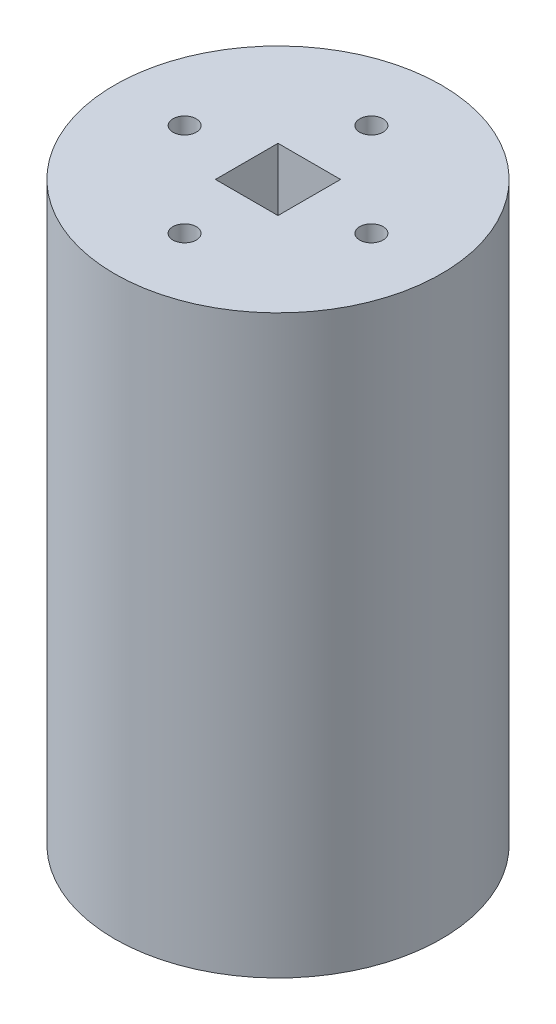
ISO-10303-21;
HEADER;
FILE_DESCRIPTION(('STEP AP214'),'2;1');
FILE_NAME('part.step','',(''),(''),'','','');
FILE_SCHEMA(('AUTOMOTIVE_DESIGN { 1 0 10303 214 1 1 1 1 }'));
ENDSEC;
DATA;
#1=APPLICATION_CONTEXT('core data for automotive mechanical design processes');
#2=APPLICATION_PROTOCOL_DEFINITION('international standard','automotive_design',2000,#1);
#3=PRODUCT_CONTEXT('',#1,'mechanical');
#4=PRODUCT('Part','Part','',(#3));
#5=PRODUCT_RELATED_PRODUCT_CATEGORY('part','',(#4));
#6=PRODUCT_DEFINITION_FORMATION('','',#4);
#7=PRODUCT_DEFINITION_CONTEXT('part definition',#1,'design');
#8=PRODUCT_DEFINITION('design','',#6,#7);
#9=PRODUCT_DEFINITION_SHAPE('','',#8);
#10=(LENGTH_UNIT() NAMED_UNIT(*) SI_UNIT(.MILLI.,.METRE.));
#11=(NAMED_UNIT(*) PLANE_ANGLE_UNIT() SI_UNIT($,.RADIAN.));
#12=(NAMED_UNIT(*) SI_UNIT($,.STERADIAN.) SOLID_ANGLE_UNIT());
#13=UNCERTAINTY_MEASURE_WITH_UNIT(LENGTH_MEASURE(1.E-05),#10,'distance_accuracy_value','');
#14=(GEOMETRIC_REPRESENTATION_CONTEXT(3) GLOBAL_UNCERTAINTY_ASSIGNED_CONTEXT((#13)) GLOBAL_UNIT_ASSIGNED_CONTEXT((#10,
#11,#12)) REPRESENTATION_CONTEXT('',''));
#15=CARTESIAN_POINT('',(0.,0.,0.));
#16=DIRECTION('',(0.,0.,1.));
#17=DIRECTION('',(1.,0.,0.));
#18=AXIS2_PLACEMENT_3D('',#15,#16,#17);
#19=CARTESIAN_POINT('',(0.,-61.675,-3.35));
#20=DIRECTION('',(0.,0.,1.));
#21=DIRECTION('',(1.,0.,0.));
#22=AXIS2_PLACEMENT_3D('',#19,#20,#21);
#23=PLANE('',#22);
#24=DIRECTION('',(1.,0.,0.));
#25=VECTOR('',#24,1.);
#26=CARTESIAN_POINT('',(0.,0.,-3.35));
#27=LINE('',#26,#25);
#28=CARTESIAN_POINT('',(-3.35,0.,-3.35));
#29=VERTEX_POINT('',#28);
#30=CARTESIAN_POINT('',(3.35,0.,-3.35));
#31=VERTEX_POINT('',#30);
#32=EDGE_CURVE('E119',#29,#31,#27,.T.);
#33=ORIENTED_EDGE('',*,*,#32,.F.);
#34=DIRECTION('',(0.,1.,0.));
#35=VECTOR('',#34,1.);
#36=CARTESIAN_POINT('',(-3.35,-61.675,-3.35));
#37=LINE('',#36,#35);
#38=CARTESIAN_POINT('',(-3.35,-61.675,-3.35));
#39=VERTEX_POINT('',#38);
#40=EDGE_CURVE('E11',#39,#29,#37,.T.);
#41=ORIENTED_EDGE('',*,*,#40,.F.);
#42=DIRECTION('',(1.,0.,0.));
#43=VECTOR('',#42,1.);
#44=CARTESIAN_POINT('',(0.,-61.675,-3.35));
#45=LINE('',#44,#43);
#46=CARTESIAN_POINT('',(3.35,-61.675,-3.35));
#47=VERTEX_POINT('',#46);
#48=EDGE_CURVE('E106',#39,#47,#45,.T.);
#49=ORIENTED_EDGE('',*,*,#48,.T.);
#50=DIRECTION('',(0.,1.,0.));
#51=VECTOR('',#50,1.);
#52=CARTESIAN_POINT('',(3.35,-61.675,-3.35));
#53=LINE('',#52,#51);
#54=EDGE_CURVE('E45',#47,#31,#53,.T.);
#55=ORIENTED_EDGE('',*,*,#54,.T.);
#56=EDGE_LOOP('',(#33,#41,#49,#55));
#57=FACE_BOUND('',#56,.T.);
#58=ADVANCED_FACE('F41',(#57),#23,.T.);
#59=CARTESIAN_POINT('',(-3.35,-61.675,0.));
#60=DIRECTION('',(-1.,0.,0.));
#61=DIRECTION('',(0.,0.,1.));
#62=AXIS2_PLACEMENT_3D('',#59,#60,#61);
#63=PLANE('',#62);
#64=DIRECTION('',(0.,0.,1.));
#65=VECTOR('',#64,1.);
#66=CARTESIAN_POINT('',(-3.35,0.,0.));
#67=LINE('',#66,#65);
#68=CARTESIAN_POINT('',(-3.35,0.,3.35));
#69=VERTEX_POINT('',#68);
#70=EDGE_CURVE('E129',#29,#69,#67,.T.);
#71=ORIENTED_EDGE('',*,*,#70,.T.);
#72=DIRECTION('',(0.,1.,0.));
#73=VECTOR('',#72,1.);
#74=CARTESIAN_POINT('',(-3.35,-61.675,3.35));
#75=LINE('',#74,#73);
#76=CARTESIAN_POINT('',(-3.35,-61.675,3.35));
#77=VERTEX_POINT('',#76);
#78=EDGE_CURVE('E52',#77,#69,#75,.T.);
#79=ORIENTED_EDGE('',*,*,#78,.F.);
#80=DIRECTION('',(0.,0.,1.));
#81=VECTOR('',#80,1.);
#82=CARTESIAN_POINT('',(-3.35,-61.675,0.));
#83=LINE('',#82,#81);
#84=EDGE_CURVE('E96',#39,#77,#83,.T.);
#85=ORIENTED_EDGE('',*,*,#84,.F.);
#86=ORIENTED_EDGE('',*,*,#40,.T.);
#87=EDGE_LOOP('',(#71,#79,#85,#86));
#88=FACE_BOUND('',#87,.T.);
#89=ADVANCED_FACE('F133',(#88),#63,.F.);
#90=CARTESIAN_POINT('',(0.,-61.675,3.35));
#91=DIRECTION('',(0.,0.,1.));
#92=DIRECTION('',(1.,0.,0.));
#93=AXIS2_PLACEMENT_3D('',#90,#91,#92);
#94=PLANE('',#93);
#95=DIRECTION('',(1.,0.,0.));
#96=VECTOR('',#95,1.);
#97=CARTESIAN_POINT('',(0.,0.,3.35));
#98=LINE('',#97,#96);
#99=CARTESIAN_POINT('',(3.35,0.,3.35));
#100=VERTEX_POINT('',#99);
#101=EDGE_CURVE('E77',#69,#100,#98,.T.);
#102=ORIENTED_EDGE('',*,*,#101,.T.);
#103=DIRECTION('',(0.,1.,0.));
#104=VECTOR('',#103,1.);
#105=CARTESIAN_POINT('',(3.35,-61.675,3.35));
#106=LINE('',#105,#104);
#107=CARTESIAN_POINT('',(3.35,-61.675,3.35));
#108=VERTEX_POINT('',#107);
#109=EDGE_CURVE('E101',#108,#100,#106,.T.);
#110=ORIENTED_EDGE('',*,*,#109,.F.);
#111=DIRECTION('',(1.,0.,0.));
#112=VECTOR('',#111,1.);
#113=CARTESIAN_POINT('',(0.,-61.675,3.35));
#114=LINE('',#113,#112);
#115=EDGE_CURVE('E91',#77,#108,#114,.T.);
#116=ORIENTED_EDGE('',*,*,#115,.F.);
#117=ORIENTED_EDGE('',*,*,#78,.T.);
#118=EDGE_LOOP('',(#102,#110,#116,#117));
#119=FACE_BOUND('',#118,.T.);
#120=ADVANCED_FACE('F102',(#119),#94,.F.);
#121=CARTESIAN_POINT('',(0.,-61.675,0.));
#122=DIRECTION('',(0.,1.,0.));
#123=DIRECTION('',(0.,0.,1.));
#124=AXIS2_PLACEMENT_3D('',#121,#122,#123);
#125=CYLINDRICAL_SURFACE('',#124,17.5);
#126=CARTESIAN_POINT('',(0.,-61.675,0.));
#127=DIRECTION('',(0.,1.,0.));
#128=DIRECTION('',(0.,0.,1.));
#129=AXIS2_PLACEMENT_3D('',#126,#127,#128);
#130=CIRCLE('',#129,17.5);
#131=CARTESIAN_POINT('',(0.,-61.675,17.5));
#132=VERTEX_POINT('',#131);
#133=EDGE_CURVE('E109',#132,#132,#130,.T.);
#134=ORIENTED_EDGE('',*,*,#133,.T.);
#135=EDGE_LOOP('',(#134));
#136=FACE_BOUND('',#135,.T.);
#137=CARTESIAN_POINT('',(0.,0.,0.));
#138=DIRECTION('',(0.,1.,0.));
#139=DIRECTION('',(0.,0.,1.));
#140=AXIS2_PLACEMENT_3D('',#137,#138,#139);
#141=CIRCLE('',#140,17.5);
#142=CARTESIAN_POINT('',(0.,0.,17.5));
#143=VERTEX_POINT('',#142);
#144=EDGE_CURVE('E115',#143,#143,#141,.T.);
#145=ORIENTED_EDGE('',*,*,#144,.F.);
#146=EDGE_LOOP('',(#145));
#147=FACE_BOUND('',#146,.T.);
#148=ADVANCED_FACE('F43',(#136,#147),#125,.T.);
#149=CARTESIAN_POINT('',(3.35,-61.675,0.));
#150=DIRECTION('',(-1.,0.,0.));
#151=DIRECTION('',(0.,0.,1.));
#152=AXIS2_PLACEMENT_3D('',#149,#150,#151);
#153=PLANE('',#152);
#154=DIRECTION('',(0.,0.,1.));
#155=VECTOR('',#154,1.);
#156=CARTESIAN_POINT('',(3.35,0.,0.));
#157=LINE('',#156,#155);
#158=EDGE_CURVE('E124',#31,#100,#157,.T.);
#159=ORIENTED_EDGE('',*,*,#158,.F.);
#160=ORIENTED_EDGE('',*,*,#54,.F.);
#161=DIRECTION('',(0.,0.,1.));
#162=VECTOR('',#161,1.);
#163=CARTESIAN_POINT('',(3.35,-61.675,0.));
#164=LINE('',#163,#162);
#165=EDGE_CURVE('E95',#47,#108,#164,.T.);
#166=ORIENTED_EDGE('',*,*,#165,.T.);
#167=ORIENTED_EDGE('',*,*,#109,.T.);
#168=EDGE_LOOP('',(#159,#160,#166,#167));
#169=FACE_BOUND('',#168,.T.);
#170=ADVANCED_FACE('F104',(#169),#153,.T.);
#171=CARTESIAN_POINT('',(0.,-61.675,0.));
#172=DIRECTION('',(0.,1.,0.));
#173=DIRECTION('',(0.,0.,1.));
#174=AXIS2_PLACEMENT_3D('',#171,#172,#173);
#175=PLANE('',#174);
#176=CARTESIAN_POINT('',(0.,-61.675,-10.));
#177=DIRECTION('',(0.,1.,0.));
#178=DIRECTION('',(0.,0.,1.));
#179=AXIS2_PLACEMENT_3D('',#176,#177,#178);
#180=CIRCLE('',#179,1.24999999999999);
#181=CARTESIAN_POINT('',(0.,-61.675,-8.75000000000001));
#182=VERTEX_POINT('',#181);
#183=EDGE_CURVE('E172',#182,#182,#180,.T.);
#184=ORIENTED_EDGE('',*,*,#183,.T.);
#185=EDGE_LOOP('',(#184));
#186=FACE_BOUND('',#185,.T.);
#187=CARTESIAN_POINT('',(10.,-61.675,0.));
#188=DIRECTION('',(0.,1.,0.));
#189=DIRECTION('',(0.,0.,1.));
#190=AXIS2_PLACEMENT_3D('',#187,#188,#189);
#191=CIRCLE('',#190,1.24999999999999);
#192=CARTESIAN_POINT('',(10.,-61.675,1.24999999999999));
#193=VERTEX_POINT('',#192);
#194=EDGE_CURVE('E185',#193,#193,#191,.T.);
#195=ORIENTED_EDGE('',*,*,#194,.T.);
#196=EDGE_LOOP('',(#195));
#197=FACE_BOUND('',#196,.T.);
#198=CARTESIAN_POINT('',(-10.,-61.675,0.));
#199=DIRECTION('',(0.,1.,0.));
#200=DIRECTION('',(0.,0.,1.));
#201=AXIS2_PLACEMENT_3D('',#198,#199,#200);
#202=CIRCLE('',#201,1.24999999999999);
#203=CARTESIAN_POINT('',(-10.,-61.675,1.24999999999999));
#204=VERTEX_POINT('',#203);
#205=EDGE_CURVE('E193',#204,#204,#202,.T.);
#206=ORIENTED_EDGE('',*,*,#205,.T.);
#207=EDGE_LOOP('',(#206));
#208=FACE_BOUND('',#207,.T.);
#209=CARTESIAN_POINT('',(0.,-61.675,10.));
#210=DIRECTION('',(0.,1.,0.));
#211=DIRECTION('',(0.,0.,1.));
#212=AXIS2_PLACEMENT_3D('',#209,#210,#211);
#213=CIRCLE('',#212,1.24999999999999);
#214=CARTESIAN_POINT('',(0.,-61.675,11.25));
#215=VERTEX_POINT('',#214);
#216=EDGE_CURVE('E120',#215,#215,#213,.T.);
#217=ORIENTED_EDGE('',*,*,#216,.T.);
#218=EDGE_LOOP('',(#217));
#219=FACE_BOUND('',#218,.T.);
#220=ORIENTED_EDGE('',*,*,#133,.F.);
#221=EDGE_LOOP('',(#220));
#222=FACE_BOUND('',#221,.T.);
#223=ORIENTED_EDGE('',*,*,#48,.F.);
#224=ORIENTED_EDGE('',*,*,#84,.T.);
#225=ORIENTED_EDGE('',*,*,#115,.T.);
#226=ORIENTED_EDGE('',*,*,#165,.F.);
#227=EDGE_LOOP('',(#223,#224,#225,#226));
#228=FACE_BOUND('',#227,.T.);
#229=ADVANCED_FACE('F94',(#186,#197,#208,#219,#222,#228),#175,.F.);
#230=CARTESIAN_POINT('',(0.,0.,0.));
#231=DIRECTION('',(0.,1.,0.));
#232=DIRECTION('',(0.,0.,1.));
#233=AXIS2_PLACEMENT_3D('',#230,#231,#232);
#234=PLANE('',#233);
#235=CARTESIAN_POINT('',(0.,0.,-10.));
#236=DIRECTION('',(0.,1.,0.));
#237=DIRECTION('',(0.,0.,1.));
#238=AXIS2_PLACEMENT_3D('',#235,#236,#237);
#239=CIRCLE('',#238,1.25);
#240=CARTESIAN_POINT('',(0.,0.,-8.75));
#241=VERTEX_POINT('',#240);
#242=EDGE_CURVE('E175',#241,#241,#239,.T.);
#243=ORIENTED_EDGE('',*,*,#242,.F.);
#244=EDGE_LOOP('',(#243));
#245=FACE_BOUND('',#244,.T.);
#246=CARTESIAN_POINT('',(10.,0.,0.));
#247=DIRECTION('',(0.,1.,0.));
#248=DIRECTION('',(0.,0.,1.));
#249=AXIS2_PLACEMENT_3D('',#246,#247,#248);
#250=CIRCLE('',#249,1.25);
#251=CARTESIAN_POINT('',(10.,0.,1.25));
#252=VERTEX_POINT('',#251);
#253=EDGE_CURVE('E179',#252,#252,#250,.T.);
#254=ORIENTED_EDGE('',*,*,#253,.F.);
#255=EDGE_LOOP('',(#254));
#256=FACE_BOUND('',#255,.T.);
#257=CARTESIAN_POINT('',(-10.,0.,0.));
#258=DIRECTION('',(0.,1.,0.));
#259=DIRECTION('',(0.,0.,1.));
#260=AXIS2_PLACEMENT_3D('',#257,#258,#259);
#261=CIRCLE('',#260,1.25);
#262=CARTESIAN_POINT('',(-10.,0.,1.25));
#263=VERTEX_POINT('',#262);
#264=EDGE_CURVE('E189',#263,#263,#261,.T.);
#265=ORIENTED_EDGE('',*,*,#264,.F.);
#266=EDGE_LOOP('',(#265));
#267=FACE_BOUND('',#266,.T.);
#268=CARTESIAN_POINT('',(0.,0.,10.));
#269=DIRECTION('',(0.,1.,0.));
#270=DIRECTION('',(0.,0.,1.));
#271=AXIS2_PLACEMENT_3D('',#268,#269,#270);
#272=CIRCLE('',#271,1.25);
#273=CARTESIAN_POINT('',(0.,0.,11.25));
#274=VERTEX_POINT('',#273);
#275=EDGE_CURVE('E197',#274,#274,#272,.T.);
#276=ORIENTED_EDGE('',*,*,#275,.F.);
#277=EDGE_LOOP('',(#276));
#278=FACE_BOUND('',#277,.T.);
#279=ORIENTED_EDGE('',*,*,#144,.T.);
#280=EDGE_LOOP('',(#279));
#281=FACE_BOUND('',#280,.T.);
#282=ORIENTED_EDGE('',*,*,#32,.T.);
#283=ORIENTED_EDGE('',*,*,#158,.T.);
#284=ORIENTED_EDGE('',*,*,#101,.F.);
#285=ORIENTED_EDGE('',*,*,#70,.F.);
#286=EDGE_LOOP('',(#282,#283,#284,#285));
#287=FACE_BOUND('',#286,.T.);
#288=ADVANCED_FACE('F134',(#245,#256,#267,#278,#281,#287),#234,.T.);
#289=CARTESIAN_POINT('',(0.,0.,10.));
#290=DIRECTION('',(0.,1.,0.));
#291=DIRECTION('',(0.,0.,1.));
#292=AXIS2_PLACEMENT_3D('',#289,#290,#291);
#293=CYLINDRICAL_SURFACE('',#292,1.24999999999999);
#294=ORIENTED_EDGE('',*,*,#216,.F.);
#295=EDGE_LOOP('',(#294));
#296=FACE_BOUND('',#295,.T.);
#297=ORIENTED_EDGE('',*,*,#275,.T.);
#298=EDGE_LOOP('',(#297));
#299=FACE_BOUND('',#298,.T.);
#300=ADVANCED_FACE('F148',(#296,#299),#293,.F.);
#301=CARTESIAN_POINT('',(-10.,0.,0.));
#302=DIRECTION('',(0.,1.,0.));
#303=DIRECTION('',(0.,0.,1.));
#304=AXIS2_PLACEMENT_3D('',#301,#302,#303);
#305=CYLINDRICAL_SURFACE('',#304,1.24999999999999);
#306=ORIENTED_EDGE('',*,*,#205,.F.);
#307=EDGE_LOOP('',(#306));
#308=FACE_BOUND('',#307,.T.);
#309=ORIENTED_EDGE('',*,*,#264,.T.);
#310=EDGE_LOOP('',(#309));
#311=FACE_BOUND('',#310,.T.);
#312=ADVANCED_FACE('F155',(#308,#311),#305,.F.);
#313=CARTESIAN_POINT('',(10.,0.,0.));
#314=DIRECTION('',(0.,1.,0.));
#315=DIRECTION('',(0.,0.,1.));
#316=AXIS2_PLACEMENT_3D('',#313,#314,#315);
#317=CYLINDRICAL_SURFACE('',#316,1.24999999999999);
#318=ORIENTED_EDGE('',*,*,#194,.F.);
#319=EDGE_LOOP('',(#318));
#320=FACE_BOUND('',#319,.T.);
#321=ORIENTED_EDGE('',*,*,#253,.T.);
#322=EDGE_LOOP('',(#321));
#323=FACE_BOUND('',#322,.T.);
#324=ADVANCED_FACE('F159',(#320,#323),#317,.F.);
#325=CARTESIAN_POINT('',(0.,0.,-10.));
#326=DIRECTION('',(0.,1.,0.));
#327=DIRECTION('',(0.,0.,1.));
#328=AXIS2_PLACEMENT_3D('',#325,#326,#327);
#329=CYLINDRICAL_SURFACE('',#328,1.24999999999999);
#330=ORIENTED_EDGE('',*,*,#183,.F.);
#331=EDGE_LOOP('',(#330));
#332=FACE_BOUND('',#331,.T.);
#333=ORIENTED_EDGE('',*,*,#242,.T.);
#334=EDGE_LOOP('',(#333));
#335=FACE_BOUND('',#334,.T.);
#336=ADVANCED_FACE('F163',(#332,#335),#329,.F.);
#337=CLOSED_SHELL('',(#58,#89,#120,#148,#170,#229,#288,#300,#312,#324,#336));
#338=MANIFOLD_SOLID_BREP('B2',#337);
#339=ADVANCED_BREP_SHAPE_REPRESENTATION('',(#18,#338),#14);
#340=SHAPE_DEFINITION_REPRESENTATION(#9,#339);
ENDSEC;
END-ISO-10303-21;
